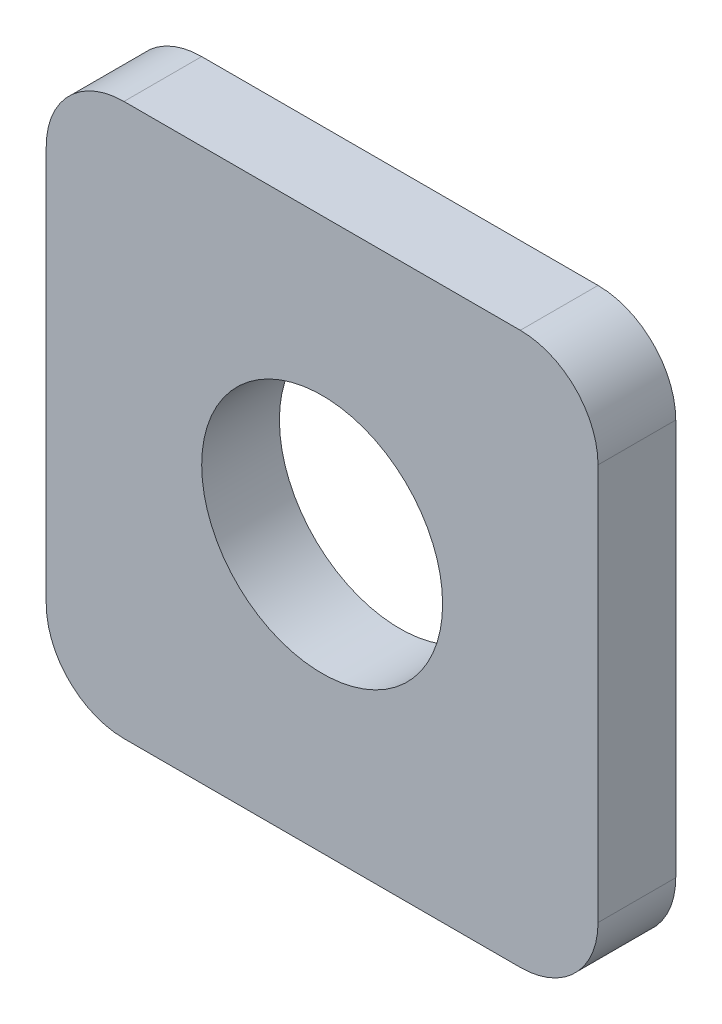
ISO-10303-21;
HEADER;
FILE_DESCRIPTION(('STEP AP214'),'2;1');
FILE_NAME('part.step','',(''),(''),'','','');
FILE_SCHEMA(('AUTOMOTIVE_DESIGN { 1 0 10303 214 1 1 1 1 }'));
ENDSEC;
DATA;
#1=APPLICATION_CONTEXT('core data for automotive mechanical design processes');
#2=APPLICATION_PROTOCOL_DEFINITION('international standard','automotive_design',2000,#1);
#3=PRODUCT_CONTEXT('',#1,'mechanical');
#4=PRODUCT('Part','Part','',(#3));
#5=PRODUCT_RELATED_PRODUCT_CATEGORY('part','',(#4));
#6=PRODUCT_DEFINITION_FORMATION('','',#4);
#7=PRODUCT_DEFINITION_CONTEXT('part definition',#1,'design');
#8=PRODUCT_DEFINITION('design','',#6,#7);
#9=PRODUCT_DEFINITION_SHAPE('','',#8);
#10=(LENGTH_UNIT() NAMED_UNIT(*) SI_UNIT(.MILLI.,.METRE.));
#11=(NAMED_UNIT(*) PLANE_ANGLE_UNIT() SI_UNIT($,.RADIAN.));
#12=(NAMED_UNIT(*) SI_UNIT($,.STERADIAN.) SOLID_ANGLE_UNIT());
#13=UNCERTAINTY_MEASURE_WITH_UNIT(LENGTH_MEASURE(1.E-05),#10,'distance_accuracy_value','');
#14=(GEOMETRIC_REPRESENTATION_CONTEXT(3) GLOBAL_UNCERTAINTY_ASSIGNED_CONTEXT((#13)) GLOBAL_UNIT_ASSIGNED_CONTEXT((#10,
#11,#12)) REPRESENTATION_CONTEXT('',''));
#15=CARTESIAN_POINT('',(0.,0.,0.));
#16=DIRECTION('',(0.,0.,1.));
#17=DIRECTION('',(1.,0.,0.));
#18=AXIS2_PLACEMENT_3D('',#15,#16,#17);
#19=CARTESIAN_POINT('',(35.5,35.5,-10.));
#20=DIRECTION('',(1.,0.,0.));
#21=DIRECTION('',(0.,1.,0.));
#22=AXIS2_PLACEMENT_3D('',#19,#20,#21);
#23=PLANE('',#22);
#24=DIRECTION('',(0.,1.,0.));
#25=VECTOR('',#24,1.);
#26=CARTESIAN_POINT('',(35.5,35.5,-10.));
#27=LINE('',#26,#25);
#28=CARTESIAN_POINT('',(35.5,-25.5,-10.));
#29=VERTEX_POINT('',#28);
#30=CARTESIAN_POINT('',(35.5,25.5,-10.));
#31=VERTEX_POINT('',#30);
#32=EDGE_CURVE('E198',#29,#31,#27,.T.);
#33=ORIENTED_EDGE('',*,*,#32,.T.);
#34=DIRECTION('',(0.,0.,1.));
#35=VECTOR('',#34,1.);
#36=CARTESIAN_POINT('',(35.5,25.5,-10.));
#37=LINE('',#36,#35);
#38=CARTESIAN_POINT('',(35.5,25.5,0.));
#39=VERTEX_POINT('',#38);
#40=EDGE_CURVE('E177',#31,#39,#37,.T.);
#41=ORIENTED_EDGE('',*,*,#40,.T.);
#42=DIRECTION('',(0.,1.,0.));
#43=VECTOR('',#42,1.);
#44=CARTESIAN_POINT('',(35.5,35.5,0.));
#45=LINE('',#44,#43);
#46=CARTESIAN_POINT('',(35.5,-25.5,0.));
#47=VERTEX_POINT('',#46);
#48=EDGE_CURVE('E114',#47,#39,#45,.T.);
#49=ORIENTED_EDGE('',*,*,#48,.F.);
#50=DIRECTION('',(0.,0.,1.));
#51=VECTOR('',#50,1.);
#52=CARTESIAN_POINT('',(35.5,-25.5,-10.));
#53=LINE('',#52,#51);
#54=EDGE_CURVE('E174',#47,#29,#53,.F.);
#55=ORIENTED_EDGE('',*,*,#54,.T.);
#56=EDGE_LOOP('',(#33,#41,#49,#55));
#57=FACE_BOUND('',#56,.T.);
#58=ADVANCED_FACE('F42',(#57),#23,.T.);
#59=CARTESIAN_POINT('',(-35.5,-35.5,-10.));
#60=DIRECTION('',(0.,-1.,0.));
#61=DIRECTION('',(0.,0.,-1.));
#62=AXIS2_PLACEMENT_3D('',#59,#60,#61);
#63=PLANE('',#62);
#64=DIRECTION('',(1.,0.,0.));
#65=VECTOR('',#64,1.);
#66=CARTESIAN_POINT('',(-35.5,-35.5,-10.));
#67=LINE('',#66,#65);
#68=CARTESIAN_POINT('',(-25.5,-35.5,-10.));
#69=VERTEX_POINT('',#68);
#70=CARTESIAN_POINT('',(25.5,-35.5,-10.));
#71=VERTEX_POINT('',#70);
#72=EDGE_CURVE('E138',#69,#71,#67,.T.);
#73=ORIENTED_EDGE('',*,*,#72,.T.);
#74=DIRECTION('',(0.,0.,1.));
#75=VECTOR('',#74,1.);
#76=CARTESIAN_POINT('',(25.5,-35.5,-10.));
#77=LINE('',#76,#75);
#78=CARTESIAN_POINT('',(25.5,-35.5,0.));
#79=VERTEX_POINT('',#78);
#80=EDGE_CURVE('E11',#71,#79,#77,.T.);
#81=ORIENTED_EDGE('',*,*,#80,.T.);
#82=DIRECTION('',(1.,0.,0.));
#83=VECTOR('',#82,1.);
#84=CARTESIAN_POINT('',(-35.5,-35.5,0.));
#85=LINE('',#84,#83);
#86=CARTESIAN_POINT('',(-25.5,-35.5,0.));
#87=VERTEX_POINT('',#86);
#88=EDGE_CURVE('E148',#87,#79,#85,.T.);
#89=ORIENTED_EDGE('',*,*,#88,.F.);
#90=DIRECTION('',(0.,0.,1.));
#91=VECTOR('',#90,1.);
#92=CARTESIAN_POINT('',(-25.5,-35.5,-10.));
#93=LINE('',#92,#91);
#94=EDGE_CURVE('E51',#87,#69,#93,.F.);
#95=ORIENTED_EDGE('',*,*,#94,.T.);
#96=EDGE_LOOP('',(#73,#81,#89,#95));
#97=FACE_BOUND('',#96,.T.);
#98=ADVANCED_FACE('F238',(#97),#63,.T.);
#99=CARTESIAN_POINT('',(-35.5,35.5,-10.));
#100=DIRECTION('',(-1.,0.,0.));
#101=DIRECTION('',(0.,0.,1.));
#102=AXIS2_PLACEMENT_3D('',#99,#100,#101);
#103=PLANE('',#102);
#104=DIRECTION('',(0.,-1.,0.));
#105=VECTOR('',#104,1.);
#106=CARTESIAN_POINT('',(-35.5,35.5,0.));
#107=LINE('',#106,#105);
#108=CARTESIAN_POINT('',(-35.5,25.5,0.));
#109=VERTEX_POINT('',#108);
#110=CARTESIAN_POINT('',(-35.5,-25.5,0.));
#111=VERTEX_POINT('',#110);
#112=EDGE_CURVE('E132',#109,#111,#107,.T.);
#113=ORIENTED_EDGE('',*,*,#112,.F.);
#114=DIRECTION('',(0.,0.,1.));
#115=VECTOR('',#114,1.);
#116=CARTESIAN_POINT('',(-35.5,25.5,-10.));
#117=LINE('',#116,#115);
#118=CARTESIAN_POINT('',(-35.5,25.5,-10.));
#119=VERTEX_POINT('',#118);
#120=EDGE_CURVE('E161',#109,#119,#117,.F.);
#121=ORIENTED_EDGE('',*,*,#120,.T.);
#122=DIRECTION('',(0.,-1.,0.));
#123=VECTOR('',#122,1.);
#124=CARTESIAN_POINT('',(-35.5,35.5,-10.));
#125=LINE('',#124,#123);
#126=CARTESIAN_POINT('',(-35.5,-25.5,-10.));
#127=VERTEX_POINT('',#126);
#128=EDGE_CURVE('E145',#119,#127,#125,.T.);
#129=ORIENTED_EDGE('',*,*,#128,.T.);
#130=DIRECTION('',(0.,0.,1.));
#131=VECTOR('',#130,1.);
#132=CARTESIAN_POINT('',(-35.5,-25.5,-10.));
#133=LINE('',#132,#131);
#134=EDGE_CURVE('E157',#127,#111,#133,.T.);
#135=ORIENTED_EDGE('',*,*,#134,.T.);
#136=EDGE_LOOP('',(#113,#121,#129,#135));
#137=FACE_BOUND('',#136,.T.);
#138=ADVANCED_FACE('F222',(#137),#103,.T.);
#139=CARTESIAN_POINT('',(-35.5,35.5,-10.));
#140=DIRECTION('',(0.,1.,0.));
#141=DIRECTION('',(0.,0.,1.));
#142=AXIS2_PLACEMENT_3D('',#139,#140,#141);
#143=PLANE('',#142);
#144=DIRECTION('',(-1.,0.,0.));
#145=VECTOR('',#144,1.);
#146=CARTESIAN_POINT('',(-35.5,35.5,-10.));
#147=LINE('',#146,#145);
#148=CARTESIAN_POINT('',(25.5,35.5,-10.));
#149=VERTEX_POINT('',#148);
#150=CARTESIAN_POINT('',(-25.5,35.5,-10.));
#151=VERTEX_POINT('',#150);
#152=EDGE_CURVE('E200',#149,#151,#147,.T.);
#153=ORIENTED_EDGE('',*,*,#152,.T.);
#154=DIRECTION('',(0.,0.,1.));
#155=VECTOR('',#154,1.);
#156=CARTESIAN_POINT('',(-25.5,35.5,-10.));
#157=LINE('',#156,#155);
#158=CARTESIAN_POINT('',(-25.5,35.5,0.));
#159=VERTEX_POINT('',#158);
#160=EDGE_CURVE('E130',#151,#159,#157,.T.);
#161=ORIENTED_EDGE('',*,*,#160,.T.);
#162=DIRECTION('',(-1.,0.,0.));
#163=VECTOR('',#162,1.);
#164=CARTESIAN_POINT('',(-35.5,35.5,0.));
#165=LINE('',#164,#163);
#166=CARTESIAN_POINT('',(25.5,35.5,0.));
#167=VERTEX_POINT('',#166);
#168=EDGE_CURVE('E112',#167,#159,#165,.T.);
#169=ORIENTED_EDGE('',*,*,#168,.F.);
#170=DIRECTION('',(0.,0.,1.));
#171=VECTOR('',#170,1.);
#172=CARTESIAN_POINT('',(25.5,35.5,-10.));
#173=LINE('',#172,#171);
#174=EDGE_CURVE('E127',#167,#149,#173,.F.);
#175=ORIENTED_EDGE('',*,*,#174,.T.);
#176=EDGE_LOOP('',(#153,#161,#169,#175));
#177=FACE_BOUND('',#176,.T.);
#178=ADVANCED_FACE('F126',(#177),#143,.T.);
#179=CARTESIAN_POINT('',(0.,0.,-10.));
#180=DIRECTION('',(0.,0.,1.));
#181=DIRECTION('',(1.,0.,0.));
#182=AXIS2_PLACEMENT_3D('',#179,#180,#181);
#183=PLANE('',#182);
#184=CARTESIAN_POINT('',(0.,0.,-10.));
#185=DIRECTION('',(0.,0.,1.));
#186=DIRECTION('',(1.,0.,0.));
#187=AXIS2_PLACEMENT_3D('',#184,#185,#186);
#188=CIRCLE('',#187,15.5);
#189=CARTESIAN_POINT('',(15.5,0.,-10.));
#190=VERTEX_POINT('',#189);
#191=EDGE_CURVE('E215',#190,#190,#188,.T.);
#192=ORIENTED_EDGE('',*,*,#191,.T.);
#193=EDGE_LOOP('',(#192));
#194=FACE_BOUND('',#193,.T.);
#195=ORIENTED_EDGE('',*,*,#128,.F.);
#196=CARTESIAN_POINT('',(-25.5,25.5,-10.));
#197=DIRECTION('',(0.,0.,1.));
#198=DIRECTION('',(1.,0.,0.));
#199=AXIS2_PLACEMENT_3D('',#196,#197,#198);
#200=CIRCLE('',#199,10.);
#201=EDGE_CURVE('E171',#119,#151,#200,.F.);
#202=ORIENTED_EDGE('',*,*,#201,.T.);
#203=ORIENTED_EDGE('',*,*,#152,.F.);
#204=CARTESIAN_POINT('',(25.5,25.5,-10.));
#205=DIRECTION('',(0.,0.,1.));
#206=DIRECTION('',(1.,0.,0.));
#207=AXIS2_PLACEMENT_3D('',#204,#205,#206);
#208=CIRCLE('',#207,10.);
#209=EDGE_CURVE('E136',#149,#31,#208,.F.);
#210=ORIENTED_EDGE('',*,*,#209,.T.);
#211=ORIENTED_EDGE('',*,*,#32,.F.);
#212=CARTESIAN_POINT('',(25.5,-25.5,-10.));
#213=DIRECTION('',(0.,0.,1.));
#214=DIRECTION('',(1.,0.,0.));
#215=AXIS2_PLACEMENT_3D('',#212,#213,#214);
#216=CIRCLE('',#215,10.);
#217=EDGE_CURVE('E58',#29,#71,#216,.F.);
#218=ORIENTED_EDGE('',*,*,#217,.T.);
#219=ORIENTED_EDGE('',*,*,#72,.F.);
#220=CARTESIAN_POINT('',(-25.5,-25.5,-10.));
#221=DIRECTION('',(0.,0.,1.));
#222=DIRECTION('',(1.,0.,0.));
#223=AXIS2_PLACEMENT_3D('',#220,#221,#222);
#224=CIRCLE('',#223,10.);
#225=EDGE_CURVE('E164',#69,#127,#224,.F.);
#226=ORIENTED_EDGE('',*,*,#225,.T.);
#227=EDGE_LOOP('',(#195,#202,#203,#210,#211,#218,#219,#226));
#228=FACE_BOUND('',#227,.T.);
#229=ADVANCED_FACE('F228',(#194,#228),#183,.F.);
#230=CARTESIAN_POINT('',(0.,0.,0.));
#231=DIRECTION('',(0.,0.,1.));
#232=DIRECTION('',(1.,0.,0.));
#233=AXIS2_PLACEMENT_3D('',#230,#231,#232);
#234=PLANE('',#233);
#235=CARTESIAN_POINT('',(0.,0.,0.));
#236=DIRECTION('',(0.,0.,1.));
#237=DIRECTION('',(1.,0.,0.));
#238=AXIS2_PLACEMENT_3D('',#235,#236,#237);
#239=CIRCLE('',#238,15.5);
#240=CARTESIAN_POINT('',(15.5,0.,0.));
#241=VERTEX_POINT('',#240);
#242=EDGE_CURVE('E208',#241,#241,#239,.T.);
#243=ORIENTED_EDGE('',*,*,#242,.F.);
#244=EDGE_LOOP('',(#243));
#245=FACE_BOUND('',#244,.T.);
#246=ORIENTED_EDGE('',*,*,#168,.T.);
#247=CARTESIAN_POINT('',(-25.5,25.5,0.));
#248=DIRECTION('',(0.,0.,1.));
#249=DIRECTION('',(1.,0.,0.));
#250=AXIS2_PLACEMENT_3D('',#247,#248,#249);
#251=CIRCLE('',#250,10.);
#252=EDGE_CURVE('E120',#159,#109,#251,.T.);
#253=ORIENTED_EDGE('',*,*,#252,.T.);
#254=ORIENTED_EDGE('',*,*,#112,.T.);
#255=CARTESIAN_POINT('',(-25.5,-25.5,0.));
#256=DIRECTION('',(0.,0.,1.));
#257=DIRECTION('',(1.,0.,0.));
#258=AXIS2_PLACEMENT_3D('',#255,#256,#257);
#259=CIRCLE('',#258,10.);
#260=EDGE_CURVE('E143',#111,#87,#259,.T.);
#261=ORIENTED_EDGE('',*,*,#260,.T.);
#262=ORIENTED_EDGE('',*,*,#88,.T.);
#263=CARTESIAN_POINT('',(25.5,-25.5,0.));
#264=DIRECTION('',(0.,0.,1.));
#265=DIRECTION('',(1.,0.,0.));
#266=AXIS2_PLACEMENT_3D('',#263,#264,#265);
#267=CIRCLE('',#266,10.);
#268=EDGE_CURVE('E121',#79,#47,#267,.T.);
#269=ORIENTED_EDGE('',*,*,#268,.T.);
#270=ORIENTED_EDGE('',*,*,#48,.T.);
#271=CARTESIAN_POINT('',(25.5,25.5,0.));
#272=DIRECTION('',(0.,0.,1.));
#273=DIRECTION('',(1.,0.,0.));
#274=AXIS2_PLACEMENT_3D('',#271,#272,#273);
#275=CIRCLE('',#274,10.);
#276=EDGE_CURVE('E109',#39,#167,#275,.T.);
#277=ORIENTED_EDGE('',*,*,#276,.T.);
#278=EDGE_LOOP('',(#246,#253,#254,#261,#262,#269,#270,#277));
#279=FACE_BOUND('',#278,.T.);
#280=ADVANCED_FACE('F111',(#245,#279),#234,.T.);
#281=CARTESIAN_POINT('',(0.,0.,-10.));
#282=DIRECTION('',(0.,0.,1.));
#283=DIRECTION('',(1.,0.,0.));
#284=AXIS2_PLACEMENT_3D('',#281,#282,#283);
#285=CYLINDRICAL_SURFACE('',#284,15.5);
#286=ORIENTED_EDGE('',*,*,#191,.F.);
#287=EDGE_LOOP('',(#286));
#288=FACE_BOUND('',#287,.T.);
#289=ORIENTED_EDGE('',*,*,#242,.T.);
#290=EDGE_LOOP('',(#289));
#291=FACE_BOUND('',#290,.T.);
#292=ADVANCED_FACE('F249',(#288,#291),#285,.F.);
#293=CARTESIAN_POINT('',(-25.5,25.5,-10.));
#294=DIRECTION('',(0.,0.,1.));
#295=DIRECTION('',(1.,0.,0.));
#296=AXIS2_PLACEMENT_3D('',#293,#294,#295);
#297=CYLINDRICAL_SURFACE('',#296,10.);
#298=ORIENTED_EDGE('',*,*,#201,.F.);
#299=ORIENTED_EDGE('',*,*,#120,.F.);
#300=ORIENTED_EDGE('',*,*,#252,.F.);
#301=ORIENTED_EDGE('',*,*,#160,.F.);
#302=EDGE_LOOP('',(#298,#299,#300,#301));
#303=FACE_BOUND('',#302,.T.);
#304=ADVANCED_FACE('F227',(#303),#297,.T.);
#305=CARTESIAN_POINT('',(25.5,25.5,-10.));
#306=DIRECTION('',(0.,0.,1.));
#307=DIRECTION('',(1.,0.,0.));
#308=AXIS2_PLACEMENT_3D('',#305,#306,#307);
#309=CYLINDRICAL_SURFACE('',#308,10.);
#310=ORIENTED_EDGE('',*,*,#209,.F.);
#311=ORIENTED_EDGE('',*,*,#174,.F.);
#312=ORIENTED_EDGE('',*,*,#276,.F.);
#313=ORIENTED_EDGE('',*,*,#40,.F.);
#314=EDGE_LOOP('',(#310,#311,#312,#313));
#315=FACE_BOUND('',#314,.T.);
#316=ADVANCED_FACE('F135',(#315),#309,.T.);
#317=CARTESIAN_POINT('',(25.5,-25.5,-10.));
#318=DIRECTION('',(0.,0.,1.));
#319=DIRECTION('',(1.,0.,0.));
#320=AXIS2_PLACEMENT_3D('',#317,#318,#319);
#321=CYLINDRICAL_SURFACE('',#320,10.);
#322=ORIENTED_EDGE('',*,*,#217,.F.);
#323=ORIENTED_EDGE('',*,*,#54,.F.);
#324=ORIENTED_EDGE('',*,*,#268,.F.);
#325=ORIENTED_EDGE('',*,*,#80,.F.);
#326=EDGE_LOOP('',(#322,#323,#324,#325));
#327=FACE_BOUND('',#326,.T.);
#328=ADVANCED_FACE('F232',(#327),#321,.T.);
#329=CARTESIAN_POINT('',(-25.5,-25.5,-10.));
#330=DIRECTION('',(0.,0.,1.));
#331=DIRECTION('',(1.,0.,0.));
#332=AXIS2_PLACEMENT_3D('',#329,#330,#331);
#333=CYLINDRICAL_SURFACE('',#332,10.);
#334=ORIENTED_EDGE('',*,*,#225,.F.);
#335=ORIENTED_EDGE('',*,*,#94,.F.);
#336=ORIENTED_EDGE('',*,*,#260,.F.);
#337=ORIENTED_EDGE('',*,*,#134,.F.);
#338=EDGE_LOOP('',(#334,#335,#336,#337));
#339=FACE_BOUND('',#338,.T.);
#340=ADVANCED_FACE('F44',(#339),#333,.T.);
#341=CLOSED_SHELL('',(#58,#98,#138,#178,#229,#280,#292,#304,#316,#328,#340));
#342=MANIFOLD_SOLID_BREP('B2',#341);
#343=ADVANCED_BREP_SHAPE_REPRESENTATION('',(#18,#342),#14);
#344=SHAPE_DEFINITION_REPRESENTATION(#9,#343);
ENDSEC;
END-ISO-10303-21;
